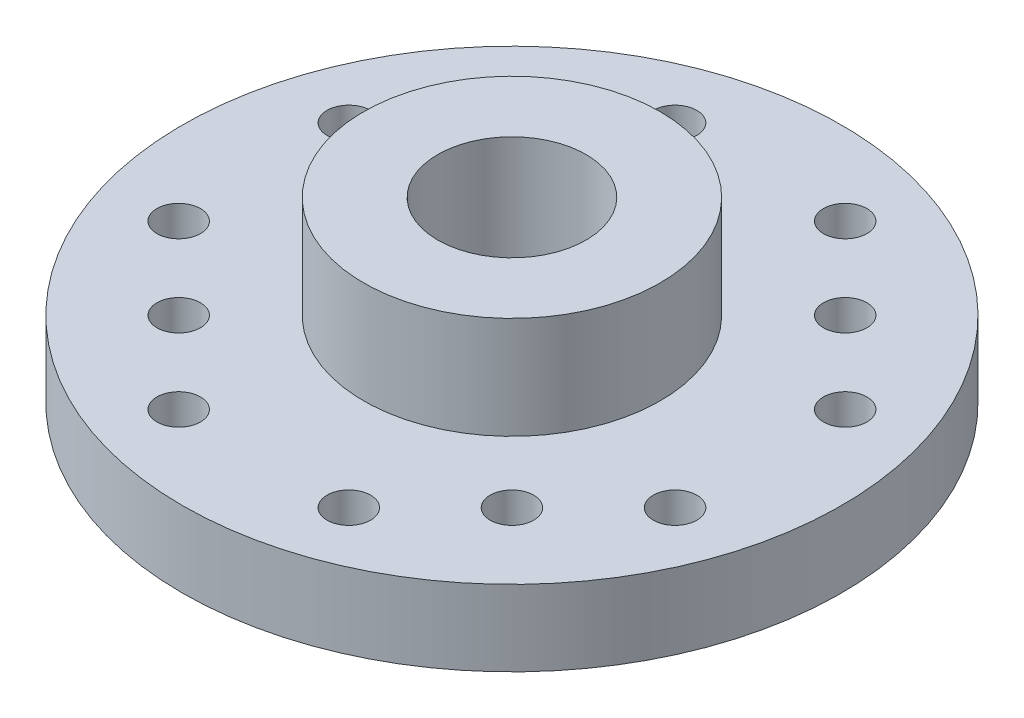
ISO-10303-21;
HEADER;
FILE_DESCRIPTION(('STEP AP214'),'2;1');
FILE_NAME('part.step','',(''),(''),'','','');
FILE_SCHEMA(('AUTOMOTIVE_DESIGN { 1 0 10303 214 1 1 1 1 }'));
ENDSEC;
DATA;
#1=APPLICATION_CONTEXT('core data for automotive mechanical design processes');
#2=APPLICATION_PROTOCOL_DEFINITION('international standard','automotive_design',2000,#1);
#3=PRODUCT_CONTEXT('',#1,'mechanical');
#4=PRODUCT('Part','Part','',(#3));
#5=PRODUCT_RELATED_PRODUCT_CATEGORY('part','',(#4));
#6=PRODUCT_DEFINITION_FORMATION('','',#4);
#7=PRODUCT_DEFINITION_CONTEXT('part definition',#1,'design');
#8=PRODUCT_DEFINITION('design','',#6,#7);
#9=PRODUCT_DEFINITION_SHAPE('','',#8);
#10=(LENGTH_UNIT() NAMED_UNIT(*) SI_UNIT(.MILLI.,.METRE.));
#11=(NAMED_UNIT(*) PLANE_ANGLE_UNIT() SI_UNIT($,.RADIAN.));
#12=(NAMED_UNIT(*) SI_UNIT($,.STERADIAN.) SOLID_ANGLE_UNIT());
#13=UNCERTAINTY_MEASURE_WITH_UNIT(LENGTH_MEASURE(1.E-05),#10,'distance_accuracy_value','');
#14=(GEOMETRIC_REPRESENTATION_CONTEXT(3) GLOBAL_UNCERTAINTY_ASSIGNED_CONTEXT((#13)) GLOBAL_UNIT_ASSIGNED_CONTEXT((#10,
#11,#12)) REPRESENTATION_CONTEXT('',''));
#15=CARTESIAN_POINT('',(0.,0.,0.));
#16=DIRECTION('',(0.,0.,1.));
#17=DIRECTION('',(1.,0.,0.));
#18=AXIS2_PLACEMENT_3D('',#15,#16,#17);
#19=CARTESIAN_POINT('',(0.,2.3,0.));
#20=DIRECTION('',(0.,-1.,0.));
#21=DIRECTION('',(0.,0.,-1.));
#22=AXIS2_PLACEMENT_3D('',#19,#20,#21);
#23=CYLINDRICAL_SURFACE('',#22,1.5);
#24=CARTESIAN_POINT('',(0.,1.8,0.));
#25=DIRECTION('',(0.,1.,0.));
#26=DIRECTION('',(0.,0.,1.));
#27=AXIS2_PLACEMENT_3D('',#24,#25,#26);
#28=CIRCLE('',#27,1.5);
#29=CARTESIAN_POINT('',(0.,1.8,1.5));
#30=VERTEX_POINT('',#29);
#31=EDGE_CURVE('E42',#30,#30,#28,.T.);
#32=ORIENTED_EDGE('',*,*,#31,.T.);
#33=EDGE_LOOP('',(#32));
#34=FACE_BOUND('',#33,.T.);
#35=CARTESIAN_POINT('',(0.,0.8,0.));
#36=DIRECTION('',(0.,-1.,0.));
#37=DIRECTION('',(0.,0.,-1.));
#38=AXIS2_PLACEMENT_3D('',#35,#36,#37);
#39=CIRCLE('',#38,1.5);
#40=CARTESIAN_POINT('',(0.,0.8,-1.5));
#41=VERTEX_POINT('',#40);
#42=EDGE_CURVE('E140',#41,#41,#39,.F.);
#43=ORIENTED_EDGE('',*,*,#42,.F.);
#44=EDGE_LOOP('',(#43));
#45=FACE_BOUND('',#44,.T.);
#46=ADVANCED_FACE('F38',(#34,#45),#23,.F.);
#47=CARTESIAN_POINT('',(0.,2.3,0.));
#48=DIRECTION('',(0.,1.,0.));
#49=DIRECTION('',(0.,0.,1.));
#50=AXIS2_PLACEMENT_3D('',#47,#48,#49);
#51=PLANE('',#50);
#52=CARTESIAN_POINT('',(7.53068721963673,2.3,2.5809397513309));
#53=DIRECTION('',(0.,1.,0.));
#54=DIRECTION('',(0.,0.,1.));
#55=AXIS2_PLACEMENT_3D('',#52,#53,#54);
#56=CIRCLE('',#55,0.66);
#57=CARTESIAN_POINT('',(7.53068721963673,2.3,3.2409397513309));
#58=VERTEX_POINT('',#57);
#59=EDGE_CURVE('E86',#58,#58,#56,.T.);
#60=ORIENTED_EDGE('',*,*,#59,.F.);
#61=EDGE_LOOP('',(#60));
#62=FACE_BOUND('',#61,.T.);
#63=CARTESIAN_POINT('',(7.53068721963673,2.3,-2.5809397513309));
#64=DIRECTION('',(0.,1.,0.));
#65=DIRECTION('',(0.,0.,1.));
#66=AXIS2_PLACEMENT_3D('',#63,#64,#65);
#67=CIRCLE('',#66,0.66);
#68=CARTESIAN_POINT('',(7.53068721963673,2.3,-1.9209397513309));
#69=VERTEX_POINT('',#68);
#70=EDGE_CURVE('E91',#69,#69,#67,.T.);
#71=ORIENTED_EDGE('',*,*,#70,.F.);
#72=EDGE_LOOP('',(#71));
#73=FACE_BOUND('',#72,.T.);
#74=CARTESIAN_POINT('',(2.5809397513309,2.3,-7.53068721963673));
#75=DIRECTION('',(0.,1.,0.));
#76=DIRECTION('',(0.,0.,1.));
#77=AXIS2_PLACEMENT_3D('',#74,#75,#76);
#78=CIRCLE('',#77,0.66);
#79=CARTESIAN_POINT('',(2.5809397513309,2.3,-6.87068721963673));
#80=VERTEX_POINT('',#79);
#81=EDGE_CURVE('E94',#80,#80,#78,.T.);
#82=ORIENTED_EDGE('',*,*,#81,.F.);
#83=EDGE_LOOP('',(#82));
#84=FACE_BOUND('',#83,.T.);
#85=CARTESIAN_POINT('',(-2.58093975133089,2.3,-7.53068721963673));
#86=DIRECTION('',(0.,1.,0.));
#87=DIRECTION('',(0.,0.,1.));
#88=AXIS2_PLACEMENT_3D('',#85,#86,#87);
#89=CIRCLE('',#88,0.66);
#90=CARTESIAN_POINT('',(-2.58093975133089,2.3,-6.87068721963673));
#91=VERTEX_POINT('',#90);
#92=EDGE_CURVE('E97',#91,#91,#89,.T.);
#93=ORIENTED_EDGE('',*,*,#92,.F.);
#94=EDGE_LOOP('',(#93));
#95=FACE_BOUND('',#94,.T.);
#96=CARTESIAN_POINT('',(-7.53068721963673,2.3,-2.58093975133089));
#97=DIRECTION('',(0.,1.,0.));
#98=DIRECTION('',(0.,0.,1.));
#99=AXIS2_PLACEMENT_3D('',#96,#97,#98);
#100=CIRCLE('',#99,0.660000000000001);
#101=CARTESIAN_POINT('',(-7.53068721963673,2.3,-1.92093975133089));
#102=VERTEX_POINT('',#101);
#103=EDGE_CURVE('E100',#102,#102,#100,.T.);
#104=ORIENTED_EDGE('',*,*,#103,.F.);
#105=EDGE_LOOP('',(#104));
#106=FACE_BOUND('',#105,.T.);
#107=CARTESIAN_POINT('',(-7.53068721963673,2.3,2.5809397513309));
#108=DIRECTION('',(0.,1.,0.));
#109=DIRECTION('',(0.,0.,1.));
#110=AXIS2_PLACEMENT_3D('',#107,#108,#109);
#111=CIRCLE('',#110,0.66);
#112=CARTESIAN_POINT('',(-7.53068721963673,2.3,3.2409397513309));
#113=VERTEX_POINT('',#112);
#114=EDGE_CURVE('E103',#113,#113,#111,.T.);
#115=ORIENTED_EDGE('',*,*,#114,.F.);
#116=EDGE_LOOP('',(#115));
#117=FACE_BOUND('',#116,.T.);
#118=CARTESIAN_POINT('',(-2.5809397513309,2.3,7.53068721963673));
#119=DIRECTION('',(0.,1.,0.));
#120=DIRECTION('',(0.,0.,1.));
#121=AXIS2_PLACEMENT_3D('',#118,#119,#120);
#122=CIRCLE('',#121,0.66);
#123=CARTESIAN_POINT('',(-2.5809397513309,2.3,8.19068721963673));
#124=VERTEX_POINT('',#123);
#125=EDGE_CURVE('E106',#124,#124,#122,.T.);
#126=ORIENTED_EDGE('',*,*,#125,.F.);
#127=EDGE_LOOP('',(#126));
#128=FACE_BOUND('',#127,.T.);
#129=CARTESIAN_POINT('',(2.5809397513309,2.3,7.53068721963673));
#130=DIRECTION('',(0.,1.,0.));
#131=DIRECTION('',(0.,0.,1.));
#132=AXIS2_PLACEMENT_3D('',#129,#130,#131);
#133=CIRCLE('',#132,0.66);
#134=CARTESIAN_POINT('',(2.5809397513309,2.3,8.19068721963673));
#135=VERTEX_POINT('',#134);
#136=EDGE_CURVE('E109',#135,#135,#133,.T.);
#137=ORIENTED_EDGE('',*,*,#136,.F.);
#138=EDGE_LOOP('',(#137));
#139=FACE_BOUND('',#138,.T.);
#140=CARTESIAN_POINT('',(5.05581348548381,2.3,5.05581348548381));
#141=DIRECTION('',(0.,1.,0.));
#142=DIRECTION('',(0.,0.,1.));
#143=AXIS2_PLACEMENT_3D('',#140,#141,#142);
#144=CIRCLE('',#143,0.66);
#145=CARTESIAN_POINT('',(5.05581348548381,2.3,5.71581348548381));
#146=VERTEX_POINT('',#145);
#147=EDGE_CURVE('E62',#146,#146,#144,.T.);
#148=ORIENTED_EDGE('',*,*,#147,.F.);
#149=EDGE_LOOP('',(#148));
#150=FACE_BOUND('',#149,.T.);
#151=CARTESIAN_POINT('',(-5.05581348548381,2.3,-5.05581348548381));
#152=DIRECTION('',(0.,1.,0.));
#153=DIRECTION('',(0.,0.,1.));
#154=AXIS2_PLACEMENT_3D('',#151,#152,#153);
#155=CIRCLE('',#154,0.66);
#156=CARTESIAN_POINT('',(-5.05581348548381,2.3,-4.39581348548381));
#157=VERTEX_POINT('',#156);
#158=EDGE_CURVE('E51',#157,#157,#155,.T.);
#159=ORIENTED_EDGE('',*,*,#158,.F.);
#160=EDGE_LOOP('',(#159));
#161=FACE_BOUND('',#160,.T.);
#162=CARTESIAN_POINT('',(0.,2.3,0.));
#163=DIRECTION('',(0.,1.,0.));
#164=DIRECTION('',(0.,0.,1.));
#165=AXIS2_PLACEMENT_3D('',#162,#163,#164);
#166=CIRCLE('',#165,10.);
#167=CARTESIAN_POINT('',(0.,2.3,10.));
#168=VERTEX_POINT('',#167);
#169=EDGE_CURVE('E11',#168,#168,#166,.T.);
#170=ORIENTED_EDGE('',*,*,#169,.T.);
#171=EDGE_LOOP('',(#170));
#172=FACE_BOUND('',#171,.T.);
#173=CARTESIAN_POINT('',(5.05581348548381,2.3,-5.05581348548381));
#174=DIRECTION('',(0.,1.,0.));
#175=DIRECTION('',(0.,0.,1.));
#176=AXIS2_PLACEMENT_3D('',#173,#174,#175);
#177=CIRCLE('',#176,0.66);
#178=CARTESIAN_POINT('',(5.05581348548381,2.3,-4.39581348548381));
#179=VERTEX_POINT('',#178);
#180=EDGE_CURVE('E56',#179,#179,#177,.T.);
#181=ORIENTED_EDGE('',*,*,#180,.F.);
#182=EDGE_LOOP('',(#181));
#183=FACE_BOUND('',#182,.T.);
#184=CARTESIAN_POINT('',(-5.05581348548381,2.3,5.05581348548381));
#185=DIRECTION('',(0.,1.,0.));
#186=DIRECTION('',(0.,0.,1.));
#187=AXIS2_PLACEMENT_3D('',#184,#185,#186);
#188=CIRCLE('',#187,0.66);
#189=CARTESIAN_POINT('',(-5.05581348548381,2.3,5.71581348548381));
#190=VERTEX_POINT('',#189);
#191=EDGE_CURVE('E68',#190,#190,#188,.T.);
#192=ORIENTED_EDGE('',*,*,#191,.F.);
#193=EDGE_LOOP('',(#192));
#194=FACE_BOUND('',#193,.T.);
#195=CARTESIAN_POINT('',(0.,2.3,0.));
#196=DIRECTION('',(0.,1.,0.));
#197=DIRECTION('',(0.,0.,1.));
#198=AXIS2_PLACEMENT_3D('',#195,#196,#197);
#199=CIRCLE('',#198,4.5);
#200=CARTESIAN_POINT('',(0.,2.3,-4.5));
#201=VERTEX_POINT('',#200);
#202=EDGE_CURVE('E77',#201,#201,#199,.T.);
#203=ORIENTED_EDGE('',*,*,#202,.F.);
#204=EDGE_LOOP('',(#203));
#205=FACE_BOUND('',#204,.T.);
#206=ADVANCED_FACE('F177',(#62,#73,#84,#95,#106,#117,#128,#139,#150,#161,#172,#183,#194,#205),
#51,.T.);
#207=CARTESIAN_POINT('',(0.,0.,0.));
#208=DIRECTION('',(0.,1.,0.));
#209=DIRECTION('',(0.,0.,1.));
#210=AXIS2_PLACEMENT_3D('',#207,#208,#209);
#211=PLANE('',#210);
#212=CARTESIAN_POINT('',(0.,0.,0.));
#213=DIRECTION('',(0.,-1.,0.));
#214=DIRECTION('',(0.,0.,-1.));
#215=AXIS2_PLACEMENT_3D('',#212,#213,#214);
#216=CIRCLE('',#215,4.375);
#217=CARTESIAN_POINT('',(0.,0.,-4.375));
#218=VERTEX_POINT('',#217);
#219=EDGE_CURVE('E146',#218,#218,#216,.T.);
#220=ORIENTED_EDGE('',*,*,#219,.F.);
#221=EDGE_LOOP('',(#220));
#222=FACE_BOUND('',#221,.T.);
#223=CARTESIAN_POINT('',(7.53068721963673,0.,2.5809397513309));
#224=DIRECTION('',(0.,-1.,0.));
#225=DIRECTION('',(0.,0.,-1.));
#226=AXIS2_PLACEMENT_3D('',#223,#224,#225);
#227=CIRCLE('',#226,0.66);
#228=CARTESIAN_POINT('',(7.53068721963673,0.,1.9209397513309));
#229=VERTEX_POINT('',#228);
#230=EDGE_CURVE('E115',#229,#229,#227,.T.);
#231=ORIENTED_EDGE('',*,*,#230,.F.);
#232=EDGE_LOOP('',(#231));
#233=FACE_BOUND('',#232,.T.);
#234=CARTESIAN_POINT('',(7.53068721963673,0.,-2.5809397513309));
#235=DIRECTION('',(0.,-1.,0.));
#236=DIRECTION('',(0.,0.,-1.));
#237=AXIS2_PLACEMENT_3D('',#234,#235,#236);
#238=CIRCLE('',#237,0.66);
#239=CARTESIAN_POINT('',(7.53068721963673,0.,-3.2409397513309));
#240=VERTEX_POINT('',#239);
#241=EDGE_CURVE('E123',#240,#240,#238,.T.);
#242=ORIENTED_EDGE('',*,*,#241,.F.);
#243=EDGE_LOOP('',(#242));
#244=FACE_BOUND('',#243,.T.);
#245=CARTESIAN_POINT('',(2.5809397513309,0.,-7.53068721963673));
#246=DIRECTION('',(0.,-1.,0.));
#247=DIRECTION('',(0.,0.,-1.));
#248=AXIS2_PLACEMENT_3D('',#245,#246,#247);
#249=CIRCLE('',#248,0.66);
#250=CARTESIAN_POINT('',(2.5809397513309,0.,-8.19068721963673));
#251=VERTEX_POINT('',#250);
#252=EDGE_CURVE('E119',#251,#251,#249,.T.);
#253=ORIENTED_EDGE('',*,*,#252,.F.);
#254=EDGE_LOOP('',(#253));
#255=FACE_BOUND('',#254,.T.);
#256=CARTESIAN_POINT('',(-2.58093975133089,0.,-7.53068721963673));
#257=DIRECTION('',(0.,-1.,0.));
#258=DIRECTION('',(0.,0.,-1.));
#259=AXIS2_PLACEMENT_3D('',#256,#257,#258);
#260=CIRCLE('',#259,0.66);
#261=CARTESIAN_POINT('',(-2.58093975133089,0.,-8.19068721963673));
#262=VERTEX_POINT('',#261);
#263=EDGE_CURVE('E116',#262,#262,#260,.T.);
#264=ORIENTED_EDGE('',*,*,#263,.F.);
#265=EDGE_LOOP('',(#264));
#266=FACE_BOUND('',#265,.T.);
#267=CARTESIAN_POINT('',(-7.53068721963673,0.,-2.58093975133089));
#268=DIRECTION('',(0.,-1.,0.));
#269=DIRECTION('',(0.,0.,-1.));
#270=AXIS2_PLACEMENT_3D('',#267,#268,#269);
#271=CIRCLE('',#270,0.660000000000001);
#272=CARTESIAN_POINT('',(-7.53068721963673,0.,-3.2409397513309));
#273=VERTEX_POINT('',#272);
#274=EDGE_CURVE('E120',#273,#273,#271,.T.);
#275=ORIENTED_EDGE('',*,*,#274,.F.);
#276=EDGE_LOOP('',(#275));
#277=FACE_BOUND('',#276,.T.);
#278=CARTESIAN_POINT('',(-7.53068721963673,0.,2.5809397513309));
#279=DIRECTION('',(0.,-1.,0.));
#280=DIRECTION('',(0.,0.,-1.));
#281=AXIS2_PLACEMENT_3D('',#278,#279,#280);
#282=CIRCLE('',#281,0.66);
#283=CARTESIAN_POINT('',(-7.53068721963673,0.,1.9209397513309));
#284=VERTEX_POINT('',#283);
#285=EDGE_CURVE('E131',#284,#284,#282,.T.);
#286=ORIENTED_EDGE('',*,*,#285,.F.);
#287=EDGE_LOOP('',(#286));
#288=FACE_BOUND('',#287,.T.);
#289=CARTESIAN_POINT('',(-2.5809397513309,0.,7.53068721963673));
#290=DIRECTION('',(0.,-1.,0.));
#291=DIRECTION('',(0.,0.,-1.));
#292=AXIS2_PLACEMENT_3D('',#289,#290,#291);
#293=CIRCLE('',#292,0.66);
#294=CARTESIAN_POINT('',(-2.5809397513309,0.,6.87068721963673));
#295=VERTEX_POINT('',#294);
#296=EDGE_CURVE('E128',#295,#295,#293,.T.);
#297=ORIENTED_EDGE('',*,*,#296,.F.);
#298=EDGE_LOOP('',(#297));
#299=FACE_BOUND('',#298,.T.);
#300=CARTESIAN_POINT('',(2.5809397513309,0.,7.53068721963673));
#301=DIRECTION('',(0.,-1.,0.));
#302=DIRECTION('',(0.,0.,-1.));
#303=AXIS2_PLACEMENT_3D('',#300,#301,#302);
#304=CIRCLE('',#303,0.66);
#305=CARTESIAN_POINT('',(2.5809397513309,0.,6.87068721963673));
#306=VERTEX_POINT('',#305);
#307=EDGE_CURVE('E112',#306,#306,#304,.T.);
#308=ORIENTED_EDGE('',*,*,#307,.F.);
#309=EDGE_LOOP('',(#308));
#310=FACE_BOUND('',#309,.T.);
#311=CARTESIAN_POINT('',(0.,0.,0.));
#312=DIRECTION('',(0.,1.,0.));
#313=DIRECTION('',(0.,0.,1.));
#314=AXIS2_PLACEMENT_3D('',#311,#312,#313);
#315=CIRCLE('',#314,10.);
#316=CARTESIAN_POINT('',(0.,0.,10.));
#317=VERTEX_POINT('',#316);
#318=EDGE_CURVE('E46',#317,#317,#315,.T.);
#319=ORIENTED_EDGE('',*,*,#318,.F.);
#320=EDGE_LOOP('',(#319));
#321=FACE_BOUND('',#320,.T.);
#322=CARTESIAN_POINT('',(-5.05581348548381,0.,-5.05581348548381));
#323=DIRECTION('',(0.,1.,0.));
#324=DIRECTION('',(0.,0.,1.));
#325=AXIS2_PLACEMENT_3D('',#322,#323,#324);
#326=CIRCLE('',#325,0.66);
#327=CARTESIAN_POINT('',(-5.05581348548381,0.,-4.39581348548381));
#328=VERTEX_POINT('',#327);
#329=EDGE_CURVE('E53',#328,#328,#326,.T.);
#330=ORIENTED_EDGE('',*,*,#329,.T.);
#331=EDGE_LOOP('',(#330));
#332=FACE_BOUND('',#331,.T.);
#333=CARTESIAN_POINT('',(5.05581348548381,0.,-5.05581348548381));
#334=DIRECTION('',(0.,1.,0.));
#335=DIRECTION('',(0.,0.,1.));
#336=AXIS2_PLACEMENT_3D('',#333,#334,#335);
#337=CIRCLE('',#336,0.66);
#338=CARTESIAN_POINT('',(5.05581348548381,0.,-4.39581348548381));
#339=VERTEX_POINT('',#338);
#340=EDGE_CURVE('E59',#339,#339,#337,.T.);
#341=ORIENTED_EDGE('',*,*,#340,.T.);
#342=EDGE_LOOP('',(#341));
#343=FACE_BOUND('',#342,.T.);
#344=CARTESIAN_POINT('',(5.05581348548381,0.,5.05581348548381));
#345=DIRECTION('',(0.,1.,0.));
#346=DIRECTION('',(0.,0.,1.));
#347=AXIS2_PLACEMENT_3D('',#344,#345,#346);
#348=CIRCLE('',#347,0.66);
#349=CARTESIAN_POINT('',(5.05581348548381,0.,5.71581348548381));
#350=VERTEX_POINT('',#349);
#351=EDGE_CURVE('E65',#350,#350,#348,.T.);
#352=ORIENTED_EDGE('',*,*,#351,.T.);
#353=EDGE_LOOP('',(#352));
#354=FACE_BOUND('',#353,.T.);
#355=CARTESIAN_POINT('',(-5.05581348548381,0.,5.05581348548381));
#356=DIRECTION('',(0.,1.,0.));
#357=DIRECTION('',(0.,0.,1.));
#358=AXIS2_PLACEMENT_3D('',#355,#356,#357);
#359=CIRCLE('',#358,0.66);
#360=CARTESIAN_POINT('',(-5.05581348548381,0.,5.71581348548381));
#361=VERTEX_POINT('',#360);
#362=EDGE_CURVE('E71',#361,#361,#359,.T.);
#363=ORIENTED_EDGE('',*,*,#362,.T.);
#364=EDGE_LOOP('',(#363));
#365=FACE_BOUND('',#364,.T.);
#366=ADVANCED_FACE('F174',(#222,#233,#244,#255,#266,#277,#288,#299,#310,#321,#332,#343,#354,
#365),#211,.F.);
#367=CARTESIAN_POINT('',(0.,2.3,0.));
#368=DIRECTION('',(0.,-1.,0.));
#369=DIRECTION('',(0.,0.,-1.));
#370=AXIS2_PLACEMENT_3D('',#367,#368,#369);
#371=CYLINDRICAL_SURFACE('',#370,10.);
#372=ORIENTED_EDGE('',*,*,#169,.F.);
#373=EDGE_LOOP('',(#372));
#374=FACE_BOUND('',#373,.T.);
#375=ORIENTED_EDGE('',*,*,#318,.T.);
#376=EDGE_LOOP('',(#375));
#377=FACE_BOUND('',#376,.T.);
#378=ADVANCED_FACE('F40',(#374,#377),#371,.T.);
#379=CARTESIAN_POINT('',(-5.05581348548381,2.3,-5.05581348548381));
#380=DIRECTION('',(0.,-1.,0.));
#381=DIRECTION('',(0.,0.,-1.));
#382=AXIS2_PLACEMENT_3D('',#379,#380,#381);
#383=CYLINDRICAL_SURFACE('',#382,0.66);
#384=ORIENTED_EDGE('',*,*,#158,.T.);
#385=EDGE_LOOP('',(#384));
#386=FACE_BOUND('',#385,.T.);
#387=ORIENTED_EDGE('',*,*,#329,.F.);
#388=EDGE_LOOP('',(#387));
#389=FACE_BOUND('',#388,.T.);
#390=ADVANCED_FACE('F346',(#386,#389),#383,.F.);
#391=CARTESIAN_POINT('',(5.05581348548381,2.3,-5.05581348548381));
#392=DIRECTION('',(0.,-1.,0.));
#393=DIRECTION('',(0.,0.,-1.));
#394=AXIS2_PLACEMENT_3D('',#391,#392,#393);
#395=CYLINDRICAL_SURFACE('',#394,0.66);
#396=ORIENTED_EDGE('',*,*,#180,.T.);
#397=EDGE_LOOP('',(#396));
#398=FACE_BOUND('',#397,.T.);
#399=ORIENTED_EDGE('',*,*,#340,.F.);
#400=EDGE_LOOP('',(#399));
#401=FACE_BOUND('',#400,.T.);
#402=ADVANCED_FACE('F217',(#398,#401),#395,.F.);
#403=CARTESIAN_POINT('',(5.05581348548381,2.3,5.05581348548381));
#404=DIRECTION('',(0.,-1.,0.));
#405=DIRECTION('',(0.,0.,-1.));
#406=AXIS2_PLACEMENT_3D('',#403,#404,#405);
#407=CYLINDRICAL_SURFACE('',#406,0.66);
#408=ORIENTED_EDGE('',*,*,#147,.T.);
#409=EDGE_LOOP('',(#408));
#410=FACE_BOUND('',#409,.T.);
#411=ORIENTED_EDGE('',*,*,#351,.F.);
#412=EDGE_LOOP('',(#411));
#413=FACE_BOUND('',#412,.T.);
#414=ADVANCED_FACE('F207',(#410,#413),#407,.F.);
#415=CARTESIAN_POINT('',(-5.05581348548381,2.3,5.05581348548381));
#416=DIRECTION('',(0.,-1.,0.));
#417=DIRECTION('',(0.,0.,-1.));
#418=AXIS2_PLACEMENT_3D('',#415,#416,#417);
#419=CYLINDRICAL_SURFACE('',#418,0.66);
#420=ORIENTED_EDGE('',*,*,#191,.T.);
#421=EDGE_LOOP('',(#420));
#422=FACE_BOUND('',#421,.T.);
#423=ORIENTED_EDGE('',*,*,#362,.F.);
#424=EDGE_LOOP('',(#423));
#425=FACE_BOUND('',#424,.T.);
#426=ADVANCED_FACE('F204',(#422,#425),#419,.F.);
#427=CARTESIAN_POINT('',(0.,5.4,0.));
#428=DIRECTION('',(0.,1.,0.));
#429=DIRECTION('',(0.,0.,1.));
#430=AXIS2_PLACEMENT_3D('',#427,#428,#429);
#431=PLANE('',#430);
#432=CARTESIAN_POINT('',(0.,5.4,0.));
#433=DIRECTION('',(0.,1.,0.));
#434=DIRECTION('',(0.,0.,1.));
#435=AXIS2_PLACEMENT_3D('',#432,#433,#434);
#436=CIRCLE('',#435,2.25);
#437=CARTESIAN_POINT('',(0.,5.4,2.25));
#438=VERTEX_POINT('',#437);
#439=EDGE_CURVE('E82',#438,#438,#436,.T.);
#440=ORIENTED_EDGE('',*,*,#439,.F.);
#441=EDGE_LOOP('',(#440));
#442=FACE_BOUND('',#441,.T.);
#443=CARTESIAN_POINT('',(0.,5.4,0.));
#444=DIRECTION('',(0.,1.,0.));
#445=DIRECTION('',(0.,0.,1.));
#446=AXIS2_PLACEMENT_3D('',#443,#444,#445);
#447=CIRCLE('',#446,4.5);
#448=CARTESIAN_POINT('',(0.,5.4,-4.5));
#449=VERTEX_POINT('',#448);
#450=EDGE_CURVE('E74',#449,#449,#447,.T.);
#451=ORIENTED_EDGE('',*,*,#450,.T.);
#452=EDGE_LOOP('',(#451));
#453=FACE_BOUND('',#452,.T.);
#454=ADVANCED_FACE('F206',(#442,#453),#431,.T.);
#455=CARTESIAN_POINT('',(0.,5.4,0.));
#456=DIRECTION('',(0.,-1.,0.));
#457=DIRECTION('',(0.,0.,-1.));
#458=AXIS2_PLACEMENT_3D('',#455,#456,#457);
#459=CYLINDRICAL_SURFACE('',#458,4.5);
#460=CARTESIAN_POINT('',(0.,5.4,-4.5));
#461=CARTESIAN_POINT('',(0.,5.36770833333333,-4.5));
#462=CARTESIAN_POINT('',(0.,5.33541666666667,-4.5));
#463=CARTESIAN_POINT('',(0.,5.27083333333333,-4.5));
#464=CARTESIAN_POINT('',(0.,5.23854166666667,-4.5));
#465=CARTESIAN_POINT('',(0.,5.17395833333333,-4.5));
#466=CARTESIAN_POINT('',(0.,5.14166666666667,-4.5));
#467=CARTESIAN_POINT('',(0.,5.07708333333333,-4.5));
#468=CARTESIAN_POINT('',(0.,5.04479166666667,-4.5));
#469=CARTESIAN_POINT('',(0.,4.98020833333333,-4.5));
#470=CARTESIAN_POINT('',(0.,4.94791666666667,-4.5));
#471=CARTESIAN_POINT('',(0.,4.88333333333333,-4.5));
#472=CARTESIAN_POINT('',(0.,4.85104166666667,-4.5));
#473=CARTESIAN_POINT('',(0.,4.78645833333333,-4.5));
#474=CARTESIAN_POINT('',(0.,4.75416666666667,-4.5));
#475=CARTESIAN_POINT('',(0.,4.68958333333333,-4.5));
#476=CARTESIAN_POINT('',(0.,4.65729166666667,-4.5));
#477=CARTESIAN_POINT('',(0.,4.59270833333333,-4.5));
#478=CARTESIAN_POINT('',(0.,4.56041666666667,-4.5));
#479=CARTESIAN_POINT('',(0.,4.49583333333333,-4.5));
#480=CARTESIAN_POINT('',(0.,4.46354166666667,-4.5));
#481=CARTESIAN_POINT('',(0.,4.39895833333333,-4.5));
#482=CARTESIAN_POINT('',(0.,4.36666666666667,-4.5));
#483=CARTESIAN_POINT('',(0.,4.30208333333333,-4.5));
#484=CARTESIAN_POINT('',(0.,4.26979166666667,-4.5));
#485=CARTESIAN_POINT('',(0.,4.20520833333333,-4.5));
#486=CARTESIAN_POINT('',(0.,4.17291666666667,-4.5));
#487=CARTESIAN_POINT('',(0.,4.10833333333333,-4.5));
#488=CARTESIAN_POINT('',(0.,4.07604166666667,-4.5));
#489=CARTESIAN_POINT('',(0.,4.01145833333333,-4.5));
#490=CARTESIAN_POINT('',(0.,3.97916666666667,-4.5));
#491=CARTESIAN_POINT('',(0.,3.91458333333333,-4.5));
#492=CARTESIAN_POINT('',(0.,3.88229166666667,-4.5));
#493=CARTESIAN_POINT('',(0.,3.81770833333333,-4.5));
#494=CARTESIAN_POINT('',(0.,3.78541666666667,-4.5));
#495=CARTESIAN_POINT('',(0.,3.72083333333333,-4.5));
#496=CARTESIAN_POINT('',(0.,3.68854166666667,-4.5));
#497=CARTESIAN_POINT('',(0.,3.62395833333333,-4.5));
#498=CARTESIAN_POINT('',(0.,3.59166666666667,-4.5));
#499=CARTESIAN_POINT('',(0.,3.52708333333333,-4.5));
#500=CARTESIAN_POINT('',(0.,3.49479166666667,-4.5));
#501=CARTESIAN_POINT('',(0.,3.43020833333333,-4.5));
#502=CARTESIAN_POINT('',(0.,3.39791666666667,-4.5));
#503=CARTESIAN_POINT('',(0.,3.33333333333333,-4.5));
#504=CARTESIAN_POINT('',(0.,3.30104166666667,-4.5));
#505=CARTESIAN_POINT('',(0.,3.23645833333333,-4.5));
#506=CARTESIAN_POINT('',(0.,3.20416666666667,-4.5));
#507=CARTESIAN_POINT('',(0.,3.13958333333333,-4.5));
#508=CARTESIAN_POINT('',(0.,3.10729166666667,-4.5));
#509=CARTESIAN_POINT('',(0.,3.04270833333333,-4.5));
#510=CARTESIAN_POINT('',(0.,3.01041666666667,-4.5));
#511=CARTESIAN_POINT('',(0.,2.94583333333333,-4.5));
#512=CARTESIAN_POINT('',(0.,2.91354166666667,-4.5));
#513=CARTESIAN_POINT('',(0.,2.84895833333333,-4.5));
#514=CARTESIAN_POINT('',(0.,2.81666666666667,-4.5));
#515=CARTESIAN_POINT('',(0.,2.75208333333333,-4.5));
#516=CARTESIAN_POINT('',(0.,2.71979166666667,-4.5));
#517=CARTESIAN_POINT('',(0.,2.65520833333333,-4.5));
#518=CARTESIAN_POINT('',(0.,2.62291666666667,-4.5));
#519=CARTESIAN_POINT('',(0.,2.55833333333333,-4.5));
#520=CARTESIAN_POINT('',(0.,2.52604166666667,-4.5));
#521=CARTESIAN_POINT('',(0.,2.46145833333333,-4.5));
#522=CARTESIAN_POINT('',(0.,2.42916666666667,-4.5));
#523=CARTESIAN_POINT('',(0.,2.36458333333333,-4.5));
#524=CARTESIAN_POINT('',(0.,2.33229166666667,-4.5));
#525=CARTESIAN_POINT('',(0.,2.3,-4.5));
#526=B_SPLINE_CURVE_WITH_KNOTS('',3,(#460,#461,#462,#463,#464,#465,#466,#467,#468,#469,#470,
#471,#472,#473,#474,#475,#476,#477,#478,#479,#480,#481,#482,#483,#484,#485,#486,#487,#488,#489,
#490,#491,#492,#493,#494,#495,#496,#497,#498,#499,#500,#501,#502,#503,#504,#505,#506,#507,#508,
#509,#510,#511,#512,#513,#514,#515,#516,#517,#518,#519,#520,#521,#522,#523,#524,#525),
.UNSPECIFIED.,.F.,.F.,(4,2,2,2,2,2,2,2,2,2,2,2,2,2,2,2,2,2,2,2,2,2,2,2,2,2,2,2,2,2,2,2,4),(0.,
0.0968749999999997,0.193749999999999,0.290624999999999,0.3875,0.484375,0.581249999999999,
0.678125,0.775,0.871874999999999,0.96875,1.065625,1.1625,1.259375,1.35625,1.453125,1.55,
1.646875,1.74375,1.840625,1.9375,2.034375,2.13125,2.228125,2.325,2.421875,2.51875,2.615625,
2.7125,2.809375,2.90625,3.003125,3.1),.UNSPECIFIED.);
#527=EDGE_CURVE('BSEAM214',#449,#201,#526,.T.);
#528=ORIENTED_EDGE('',*,*,#450,.F.);
#529=ORIENTED_EDGE('',*,*,#202,.T.);
#530=ORIENTED_EDGE('',*,*,#527,.T.);
#531=ORIENTED_EDGE('',*,*,#527,.F.);
#532=EDGE_LOOP('',(#528,#530,#529,#531));
#533=FACE_BOUND('',#532,.T.);
#534=ADVANCED_FACE('F214',(#533),#459,.T.);
#535=CARTESIAN_POINT('',(0.,1.8,0.));
#536=DIRECTION('',(0.,1.,0.));
#537=DIRECTION('',(0.,0.,1.));
#538=AXIS2_PLACEMENT_3D('',#535,#536,#537);
#539=CYLINDRICAL_SURFACE('',#538,2.25);
#540=CARTESIAN_POINT('',(0.,1.8,0.));
#541=DIRECTION('',(0.,1.,0.));
#542=DIRECTION('',(0.,0.,1.));
#543=AXIS2_PLACEMENT_3D('',#540,#541,#542);
#544=CIRCLE('',#543,2.25);
#545=CARTESIAN_POINT('',(0.,1.8,2.25));
#546=VERTEX_POINT('',#545);
#547=EDGE_CURVE('E85',#546,#546,#544,.T.);
#548=ORIENTED_EDGE('',*,*,#547,.F.);
#549=EDGE_LOOP('',(#548));
#550=FACE_BOUND('',#549,.T.);
#551=ORIENTED_EDGE('',*,*,#439,.T.);
#552=EDGE_LOOP('',(#551));
#553=FACE_BOUND('',#552,.T.);
#554=ADVANCED_FACE('F232',(#550,#553),#539,.F.);
#555=CARTESIAN_POINT('',(0.,1.8,0.));
#556=DIRECTION('',(0.,1.,0.));
#557=DIRECTION('',(0.,0.,1.));
#558=AXIS2_PLACEMENT_3D('',#555,#556,#557);
#559=PLANE('',#558);
#560=ORIENTED_EDGE('',*,*,#31,.F.);
#561=EDGE_LOOP('',(#560));
#562=FACE_BOUND('',#561,.T.);
#563=ORIENTED_EDGE('',*,*,#547,.T.);
#564=EDGE_LOOP('',(#563));
#565=FACE_BOUND('',#564,.T.);
#566=ADVANCED_FACE('F237',(#562,#565),#559,.T.);
#567=CARTESIAN_POINT('',(2.5809397513309,5.4,7.53068721963673));
#568=DIRECTION('',(0.,-1.,0.));
#569=DIRECTION('',(0.,0.,-1.));
#570=AXIS2_PLACEMENT_3D('',#567,#568,#569);
#571=CYLINDRICAL_SURFACE('',#570,0.66);
#572=ORIENTED_EDGE('',*,*,#136,.T.);
#573=EDGE_LOOP('',(#572));
#574=FACE_BOUND('',#573,.T.);
#575=ORIENTED_EDGE('',*,*,#307,.T.);
#576=EDGE_LOOP('',(#575));
#577=FACE_BOUND('',#576,.T.);
#578=ADVANCED_FACE('F241',(#574,#577),#571,.F.);
#579=CARTESIAN_POINT('',(-2.5809397513309,5.4,7.53068721963673));
#580=DIRECTION('',(0.,-1.,0.));
#581=DIRECTION('',(0.,0.,-1.));
#582=AXIS2_PLACEMENT_3D('',#579,#580,#581);
#583=CYLINDRICAL_SURFACE('',#582,0.66);
#584=ORIENTED_EDGE('',*,*,#125,.T.);
#585=EDGE_LOOP('',(#584));
#586=FACE_BOUND('',#585,.T.);
#587=ORIENTED_EDGE('',*,*,#296,.T.);
#588=EDGE_LOOP('',(#587));
#589=FACE_BOUND('',#588,.T.);
#590=ADVANCED_FACE('F245',(#586,#589),#583,.F.);
#591=CARTESIAN_POINT('',(-7.53068721963673,5.4,2.5809397513309));
#592=DIRECTION('',(0.,-1.,0.));
#593=DIRECTION('',(0.,0.,-1.));
#594=AXIS2_PLACEMENT_3D('',#591,#592,#593);
#595=CYLINDRICAL_SURFACE('',#594,0.66);
#596=ORIENTED_EDGE('',*,*,#114,.T.);
#597=EDGE_LOOP('',(#596));
#598=FACE_BOUND('',#597,.T.);
#599=ORIENTED_EDGE('',*,*,#285,.T.);
#600=EDGE_LOOP('',(#599));
#601=FACE_BOUND('',#600,.T.);
#602=ADVANCED_FACE('F267',(#598,#601),#595,.F.);
#603=CARTESIAN_POINT('',(-7.53068721963673,5.4,-2.58093975133089));
#604=DIRECTION('',(0.,-1.,0.));
#605=DIRECTION('',(0.,0.,-1.));
#606=AXIS2_PLACEMENT_3D('',#603,#604,#605);
#607=CYLINDRICAL_SURFACE('',#606,0.660000000000001);
#608=ORIENTED_EDGE('',*,*,#103,.T.);
#609=EDGE_LOOP('',(#608));
#610=FACE_BOUND('',#609,.T.);
#611=ORIENTED_EDGE('',*,*,#274,.T.);
#612=EDGE_LOOP('',(#611));
#613=FACE_BOUND('',#612,.T.);
#614=ADVANCED_FACE('F251',(#610,#613),#607,.F.);
#615=CARTESIAN_POINT('',(-2.58093975133089,5.4,-7.53068721963673));
#616=DIRECTION('',(0.,-1.,0.));
#617=DIRECTION('',(0.,0.,-1.));
#618=AXIS2_PLACEMENT_3D('',#615,#616,#617);
#619=CYLINDRICAL_SURFACE('',#618,0.66);
#620=ORIENTED_EDGE('',*,*,#92,.T.);
#621=EDGE_LOOP('',(#620));
#622=FACE_BOUND('',#621,.T.);
#623=ORIENTED_EDGE('',*,*,#263,.T.);
#624=EDGE_LOOP('',(#623));
#625=FACE_BOUND('',#624,.T.);
#626=ADVANCED_FACE('F247',(#622,#625),#619,.F.);
#627=CARTESIAN_POINT('',(2.5809397513309,5.4,-7.53068721963673));
#628=DIRECTION('',(0.,-1.,0.));
#629=DIRECTION('',(0.,0.,-1.));
#630=AXIS2_PLACEMENT_3D('',#627,#628,#629);
#631=CYLINDRICAL_SURFACE('',#630,0.66);
#632=ORIENTED_EDGE('',*,*,#81,.T.);
#633=EDGE_LOOP('',(#632));
#634=FACE_BOUND('',#633,.T.);
#635=ORIENTED_EDGE('',*,*,#252,.T.);
#636=EDGE_LOOP('',(#635));
#637=FACE_BOUND('',#636,.T.);
#638=ADVANCED_FACE('F250',(#634,#637),#631,.F.);
#639=CARTESIAN_POINT('',(7.53068721963673,5.4,-2.5809397513309));
#640=DIRECTION('',(0.,-1.,0.));
#641=DIRECTION('',(0.,0.,-1.));
#642=AXIS2_PLACEMENT_3D('',#639,#640,#641);
#643=CYLINDRICAL_SURFACE('',#642,0.66);
#644=ORIENTED_EDGE('',*,*,#70,.T.);
#645=EDGE_LOOP('',(#644));
#646=FACE_BOUND('',#645,.T.);
#647=ORIENTED_EDGE('',*,*,#241,.T.);
#648=EDGE_LOOP('',(#647));
#649=FACE_BOUND('',#648,.T.);
#650=ADVANCED_FACE('F255',(#646,#649),#643,.F.);
#651=CARTESIAN_POINT('',(7.53068721963673,5.4,2.5809397513309));
#652=DIRECTION('',(0.,-1.,0.));
#653=DIRECTION('',(0.,0.,-1.));
#654=AXIS2_PLACEMENT_3D('',#651,#652,#653);
#655=CYLINDRICAL_SURFACE('',#654,0.66);
#656=ORIENTED_EDGE('',*,*,#59,.T.);
#657=EDGE_LOOP('',(#656));
#658=FACE_BOUND('',#657,.T.);
#659=ORIENTED_EDGE('',*,*,#230,.T.);
#660=EDGE_LOOP('',(#659));
#661=FACE_BOUND('',#660,.T.);
#662=ADVANCED_FACE('F259',(#658,#661),#655,.F.);
#663=CARTESIAN_POINT('',(0.,0.8,0.));
#664=DIRECTION('',(0.,-1.,0.));
#665=DIRECTION('',(0.,0.,-1.));
#666=AXIS2_PLACEMENT_3D('',#663,#664,#665);
#667=CYLINDRICAL_SURFACE('',#666,2.7);
#668=CARTESIAN_POINT('',(0.,0.8,0.));
#669=DIRECTION('',(0.,-1.,0.));
#670=DIRECTION('',(0.,0.,-1.));
#671=AXIS2_PLACEMENT_3D('',#668,#669,#670);
#672=CIRCLE('',#671,2.7);
#673=CARTESIAN_POINT('',(0.,0.8,-2.7));
#674=VERTEX_POINT('',#673);
#675=EDGE_CURVE('E132',#674,#674,#672,.T.);
#676=ORIENTED_EDGE('',*,*,#675,.F.);
#677=EDGE_LOOP('',(#676));
#678=FACE_BOUND('',#677,.T.);
#679=CARTESIAN_POINT('',(0.,0.,0.));
#680=DIRECTION('',(0.,-1.,0.));
#681=DIRECTION('',(0.,0.,-1.));
#682=AXIS2_PLACEMENT_3D('',#679,#680,#681);
#683=CIRCLE('',#682,2.7);
#684=CARTESIAN_POINT('',(0.,0.,-2.7));
#685=VERTEX_POINT('',#684);
#686=EDGE_CURVE('E137',#685,#685,#683,.T.);
#687=ORIENTED_EDGE('',*,*,#686,.T.);
#688=EDGE_LOOP('',(#687));
#689=FACE_BOUND('',#688,.T.);
#690=ADVANCED_FACE('F263',(#678,#689),#667,.F.);
#691=CARTESIAN_POINT('',(0.,0.8,0.));
#692=DIRECTION('',(0.,-1.,0.));
#693=DIRECTION('',(0.,0.,-1.));
#694=AXIS2_PLACEMENT_3D('',#691,#692,#693);
#695=PLANE('',#694);
#696=ORIENTED_EDGE('',*,*,#42,.T.);
#697=EDGE_LOOP('',(#696));
#698=FACE_BOUND('',#697,.T.);
#699=ORIENTED_EDGE('',*,*,#675,.T.);
#700=EDGE_LOOP('',(#699));
#701=FACE_BOUND('',#700,.T.);
#702=ADVANCED_FACE('F277',(#698,#701),#695,.T.);
#703=CARTESIAN_POINT('',(0.,0.8,0.));
#704=DIRECTION('',(0.,-1.,0.));
#705=DIRECTION('',(0.,0.,-1.));
#706=AXIS2_PLACEMENT_3D('',#703,#704,#705);
#707=CYLINDRICAL_SURFACE('',#706,3.2);
#708=CARTESIAN_POINT('',(0.,0.8,0.));
#709=DIRECTION('',(0.,-1.,0.));
#710=DIRECTION('',(0.,0.,-1.));
#711=AXIS2_PLACEMENT_3D('',#708,#709,#710);
#712=CIRCLE('',#711,3.2);
#713=CARTESIAN_POINT('',(0.,0.8,-3.2));
#714=VERTEX_POINT('',#713);
#715=EDGE_CURVE('E149',#714,#714,#712,.T.);
#716=ORIENTED_EDGE('',*,*,#715,.T.);
#717=EDGE_LOOP('',(#716));
#718=FACE_BOUND('',#717,.T.);
#719=CARTESIAN_POINT('',(0.,0.,0.));
#720=DIRECTION('',(0.,-1.,0.));
#721=DIRECTION('',(0.,0.,-1.));
#722=AXIS2_PLACEMENT_3D('',#719,#720,#721);
#723=CIRCLE('',#722,3.2);
#724=CARTESIAN_POINT('',(0.,0.,-3.2));
#725=VERTEX_POINT('',#724);
#726=EDGE_CURVE('E150',#725,#725,#723,.T.);
#727=ORIENTED_EDGE('',*,*,#726,.F.);
#728=EDGE_LOOP('',(#727));
#729=FACE_BOUND('',#728,.T.);
#730=ADVANCED_FACE('F158',(#718,#729),#707,.T.);
#731=CARTESIAN_POINT('',(0.,0.8,0.));
#732=DIRECTION('',(0.,-1.,0.));
#733=DIRECTION('',(0.,0.,-1.));
#734=AXIS2_PLACEMENT_3D('',#731,#732,#733);
#735=CYLINDRICAL_SURFACE('',#734,4.375);
#736=CARTESIAN_POINT('',(0.,0.8,0.));
#737=DIRECTION('',(0.,-1.,0.));
#738=DIRECTION('',(0.,0.,-1.));
#739=AXIS2_PLACEMENT_3D('',#736,#737,#738);
#740=CIRCLE('',#739,4.375);
#741=CARTESIAN_POINT('',(0.,0.8,-4.375));
#742=VERTEX_POINT('',#741);
#743=EDGE_CURVE('E141',#742,#742,#740,.T.);
#744=ORIENTED_EDGE('',*,*,#743,.F.);
#745=EDGE_LOOP('',(#744));
#746=FACE_BOUND('',#745,.T.);
#747=ORIENTED_EDGE('',*,*,#219,.T.);
#748=EDGE_LOOP('',(#747));
#749=FACE_BOUND('',#748,.T.);
#750=ADVANCED_FACE('F165',(#746,#749),#735,.F.);
#751=CARTESIAN_POINT('',(0.,0.8,0.));
#752=DIRECTION('',(0.,-1.,0.));
#753=DIRECTION('',(0.,0.,-1.));
#754=AXIS2_PLACEMENT_3D('',#751,#752,#753);
#755=PLANE('',#754);
#756=ORIENTED_EDGE('',*,*,#715,.F.);
#757=EDGE_LOOP('',(#756));
#758=FACE_BOUND('',#757,.T.);
#759=ORIENTED_EDGE('',*,*,#743,.T.);
#760=EDGE_LOOP('',(#759));
#761=FACE_BOUND('',#760,.T.);
#762=ADVANCED_FACE('F161',(#758,#761),#755,.T.);
#763=ORIENTED_EDGE('',*,*,#686,.F.);
#764=EDGE_LOOP('',(#763));
#765=FACE_BOUND('',#764,.T.);
#766=ORIENTED_EDGE('',*,*,#726,.T.);
#767=EDGE_LOOP('',(#766));
#768=FACE_BOUND('',#767,.T.);
#769=ADVANCED_FACE('F164',(#765,#768),#211,.F.);
#770=CLOSED_SHELL('',(#46,#206,#366,#378,#390,#402,#414,#426,#454,#534,#554,#566,#578,#590,#602,
#614,#626,#638,#650,#662,#690,#702,#730,#750,#762,#769));
#771=MANIFOLD_SOLID_BREP('B2',#770);
#772=ADVANCED_BREP_SHAPE_REPRESENTATION('',(#18,#771),#14);
#773=SHAPE_DEFINITION_REPRESENTATION(#9,#772);
ENDSEC;
END-ISO-10303-21;
